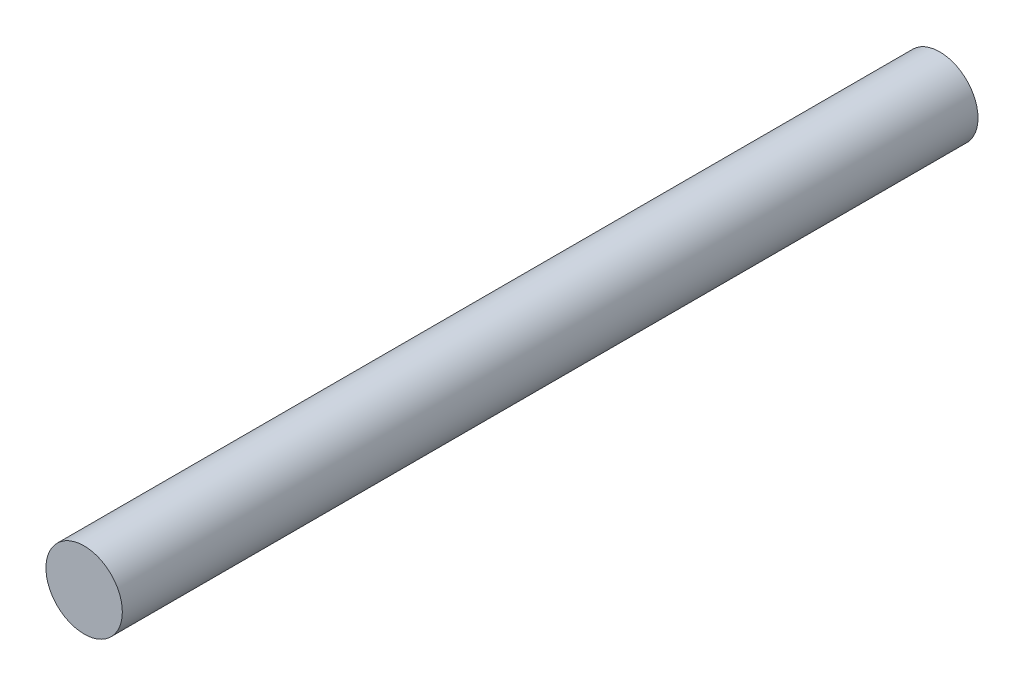
ISO-10303-21;
HEADER;
FILE_DESCRIPTION(('STEP AP214'),'2;1');
FILE_NAME('part.step','',(''),(''),'','','');
FILE_SCHEMA(('AUTOMOTIVE_DESIGN { 1 0 10303 214 1 1 1 1 }'));
ENDSEC;
DATA;
#1=APPLICATION_CONTEXT('core data for automotive mechanical design processes');
#2=APPLICATION_PROTOCOL_DEFINITION('international standard','automotive_design',2000,#1);
#3=PRODUCT_CONTEXT('',#1,'mechanical');
#4=PRODUCT('Part','Part','',(#3));
#5=PRODUCT_RELATED_PRODUCT_CATEGORY('part','',(#4));
#6=PRODUCT_DEFINITION_FORMATION('','',#4);
#7=PRODUCT_DEFINITION_CONTEXT('part definition',#1,'design');
#8=PRODUCT_DEFINITION('design','',#6,#7);
#9=PRODUCT_DEFINITION_SHAPE('','',#8);
#10=(LENGTH_UNIT() NAMED_UNIT(*) SI_UNIT(.MILLI.,.METRE.));
#11=(NAMED_UNIT(*) PLANE_ANGLE_UNIT() SI_UNIT($,.RADIAN.));
#12=(NAMED_UNIT(*) SI_UNIT($,.STERADIAN.) SOLID_ANGLE_UNIT());
#13=UNCERTAINTY_MEASURE_WITH_UNIT(LENGTH_MEASURE(1.E-05),#10,'distance_accuracy_value','');
#14=(GEOMETRIC_REPRESENTATION_CONTEXT(3) GLOBAL_UNCERTAINTY_ASSIGNED_CONTEXT((#13)) GLOBAL_UNIT_ASSIGNED_CONTEXT((#10,
#11,#12)) REPRESENTATION_CONTEXT('',''));
#15=CARTESIAN_POINT('',(0.,0.,0.));
#16=DIRECTION('',(0.,0.,1.));
#17=DIRECTION('',(1.,0.,0.));
#18=AXIS2_PLACEMENT_3D('',#15,#16,#17);
#19=CARTESIAN_POINT('',(0.,0.,44.45));
#20=DIRECTION('',(0.,0.,-1.));
#21=DIRECTION('',(-1.,0.,0.));
#22=AXIS2_PLACEMENT_3D('',#19,#20,#21);
#23=CYLINDRICAL_SURFACE('',#22,1.984375);
#24=CARTESIAN_POINT('',(0.,0.,44.45));
#25=DIRECTION('',(0.,0.,1.));
#26=DIRECTION('',(1.,0.,0.));
#27=AXIS2_PLACEMENT_3D('',#24,#25,#26);
#28=CIRCLE('',#27,1.984375);
#29=CARTESIAN_POINT('',(1.984375,0.,44.45));
#30=VERTEX_POINT('',#29);
#31=EDGE_CURVE('E10',#30,#30,#28,.T.);
#32=ORIENTED_EDGE('',*,*,#31,.F.);
#33=EDGE_LOOP('',(#32));
#34=FACE_BOUND('',#33,.T.);
#35=CARTESIAN_POINT('',(0.,0.,0.));
#36=DIRECTION('',(0.,0.,1.));
#37=DIRECTION('',(1.,0.,0.));
#38=AXIS2_PLACEMENT_3D('',#35,#36,#37);
#39=CIRCLE('',#38,1.984375);
#40=CARTESIAN_POINT('',(1.984375,0.,0.));
#41=VERTEX_POINT('',#40);
#42=EDGE_CURVE('E34',#41,#41,#39,.T.);
#43=ORIENTED_EDGE('',*,*,#42,.T.);
#44=EDGE_LOOP('',(#43));
#45=FACE_BOUND('',#44,.T.);
#46=ADVANCED_FACE('F31',(#34,#45),#23,.T.);
#47=CARTESIAN_POINT('',(0.,0.,44.45));
#48=DIRECTION('',(0.,0.,1.));
#49=DIRECTION('',(1.,0.,0.));
#50=AXIS2_PLACEMENT_3D('',#47,#48,#49);
#51=PLANE('',#50);
#52=ORIENTED_EDGE('',*,*,#31,.T.);
#53=EDGE_LOOP('',(#52));
#54=FACE_BOUND('',#53,.T.);
#55=ADVANCED_FACE('F46',(#54),#51,.T.);
#56=CARTESIAN_POINT('',(0.,0.,0.));
#57=DIRECTION('',(0.,0.,1.));
#58=DIRECTION('',(1.,0.,0.));
#59=AXIS2_PLACEMENT_3D('',#56,#57,#58);
#60=PLANE('',#59);
#61=ORIENTED_EDGE('',*,*,#42,.F.);
#62=EDGE_LOOP('',(#61));
#63=FACE_BOUND('',#62,.T.);
#64=ADVANCED_FACE('F44',(#63),#60,.F.);
#65=CLOSED_SHELL('',(#46,#55,#64));
#66=MANIFOLD_SOLID_BREP('B2',#65);
#67=ADVANCED_BREP_SHAPE_REPRESENTATION('',(#18,#66),#14);
#68=SHAPE_DEFINITION_REPRESENTATION(#9,#67);
ENDSEC;
END-ISO-10303-21;
